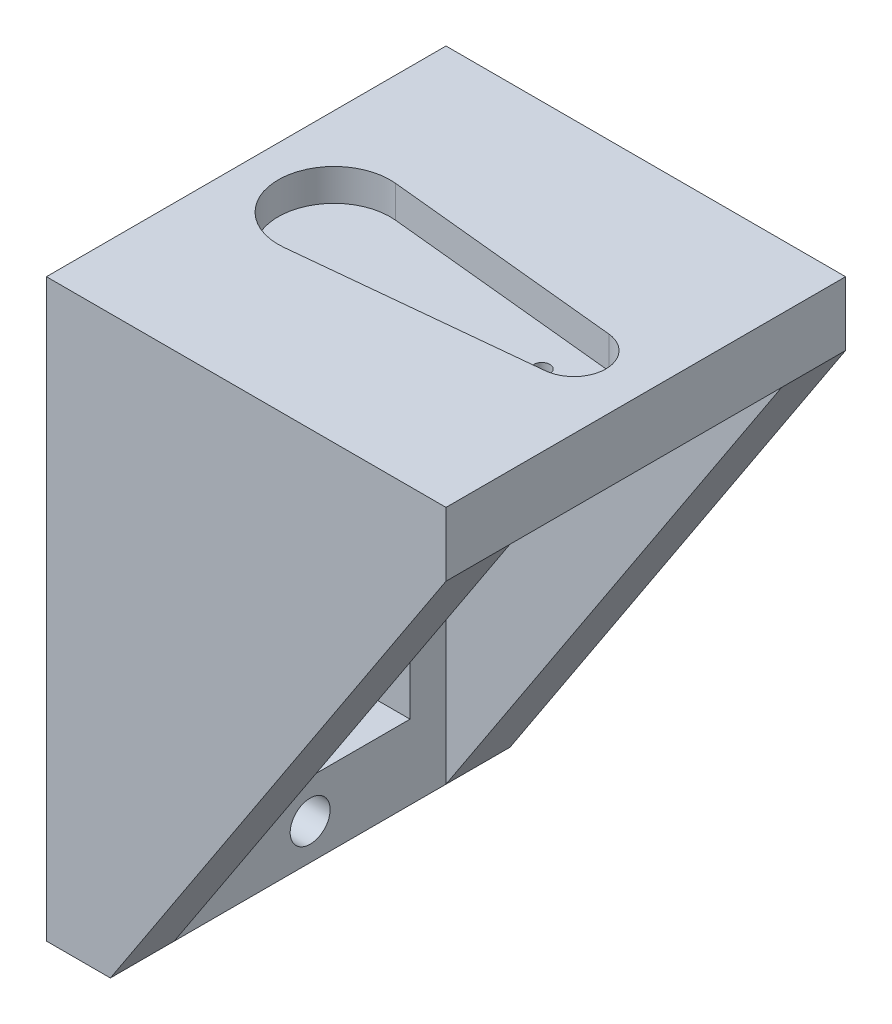
ISO-10303-21;
HEADER;
FILE_DESCRIPTION(('STEP AP214'),'2;1');
FILE_NAME('part.step','',(''),(''),'','','');
FILE_SCHEMA(('AUTOMOTIVE_DESIGN { 1 0 10303 214 1 1 1 1 }'));
ENDSEC;
DATA;
#1=APPLICATION_CONTEXT('core data for automotive mechanical design processes');
#2=APPLICATION_PROTOCOL_DEFINITION('international standard','automotive_design',2000,#1);
#3=PRODUCT_CONTEXT('',#1,'mechanical');
#4=PRODUCT('Part','Part','',(#3));
#5=PRODUCT_RELATED_PRODUCT_CATEGORY('part','',(#4));
#6=PRODUCT_DEFINITION_FORMATION('','',#4);
#7=PRODUCT_DEFINITION_CONTEXT('part definition',#1,'design');
#8=PRODUCT_DEFINITION('design','',#6,#7);
#9=PRODUCT_DEFINITION_SHAPE('','',#8);
#10=(LENGTH_UNIT() NAMED_UNIT(*) SI_UNIT(.MILLI.,.METRE.));
#11=(NAMED_UNIT(*) PLANE_ANGLE_UNIT() SI_UNIT($,.RADIAN.));
#12=(NAMED_UNIT(*) SI_UNIT($,.STERADIAN.) SOLID_ANGLE_UNIT());
#13=UNCERTAINTY_MEASURE_WITH_UNIT(LENGTH_MEASURE(1.E-05),#10,'distance_accuracy_value','');
#14=(GEOMETRIC_REPRESENTATION_CONTEXT(3) GLOBAL_UNCERTAINTY_ASSIGNED_CONTEXT((#13)) GLOBAL_UNIT_ASSIGNED_CONTEXT((#10,
#11,#12)) REPRESENTATION_CONTEXT('',''));
#15=CARTESIAN_POINT('',(0.,0.,0.));
#16=DIRECTION('',(0.,0.,1.));
#17=DIRECTION('',(1.,0.,0.));
#18=AXIS2_PLACEMENT_3D('',#15,#16,#17);
#19=CARTESIAN_POINT('',(12.5,4.,-12.5));
#20=DIRECTION('',(-1.,0.,0.));
#21=DIRECTION('',(0.,0.,1.));
#22=AXIS2_PLACEMENT_3D('',#19,#20,#21);
#23=PLANE('',#22);
#24=DIRECTION('',(0.,0.,-1.));
#25=VECTOR('',#24,1.);
#26=CARTESIAN_POINT('',(12.5,0.,23.5));
#27=LINE('',#26,#25);
#28=CARTESIAN_POINT('',(12.5,0.,-8.5));
#29=VERTEX_POINT('',#28);
#30=CARTESIAN_POINT('',(12.5,0.,-12.5));
#31=VERTEX_POINT('',#30);
#32=EDGE_CURVE('E225',#29,#31,#27,.T.);
#33=ORIENTED_EDGE('',*,*,#32,.T.);
#34=DIRECTION('',(0.,-1.,0.));
#35=VECTOR('',#34,1.);
#36=CARTESIAN_POINT('',(12.5,4.,-12.5));
#37=LINE('',#36,#35);
#38=CARTESIAN_POINT('',(12.5,4.,-12.5));
#39=VERTEX_POINT('',#38);
#40=EDGE_CURVE('E78',#39,#31,#37,.T.);
#41=ORIENTED_EDGE('',*,*,#40,.F.);
#42=DIRECTION('',(0.,0.,-1.));
#43=VECTOR('',#42,1.);
#44=CARTESIAN_POINT('',(12.5,4.,-12.5));
#45=LINE('',#44,#43);
#46=CARTESIAN_POINT('',(12.5,4.,12.5));
#47=VERTEX_POINT('',#46);
#48=EDGE_CURVE('E299',#47,#39,#45,.T.);
#49=ORIENTED_EDGE('',*,*,#48,.F.);
#50=DIRECTION('',(0.,-1.,0.));
#51=VECTOR('',#50,1.);
#52=CARTESIAN_POINT('',(12.5,4.,12.5));
#53=LINE('',#52,#51);
#54=CARTESIAN_POINT('',(12.5,0.,12.5));
#55=VERTEX_POINT('',#54);
#56=EDGE_CURVE('E308',#47,#55,#53,.T.);
#57=ORIENTED_EDGE('',*,*,#56,.T.);
#58=CARTESIAN_POINT('',(12.5,0.,8.5));
#59=VERTEX_POINT('',#58);
#60=EDGE_CURVE('E228',#55,#59,#27,.T.);
#61=ORIENTED_EDGE('',*,*,#60,.T.);
#62=DIRECTION('',(0.,0.,-1.));
#63=VECTOR('',#62,1.);
#64=CARTESIAN_POINT('',(12.5,0.,-12.5));
#65=LINE('',#64,#63);
#66=EDGE_CURVE('E298',#59,#29,#65,.T.);
#67=ORIENTED_EDGE('',*,*,#66,.T.);
#68=EDGE_LOOP('',(#33,#41,#49,#57,#61,#67));
#69=FACE_BOUND('',#68,.T.);
#70=ADVANCED_FACE('F71',(#69),#23,.F.);
#71=CARTESIAN_POINT('',(-12.5,4.,-12.5));
#72=DIRECTION('',(0.,0.,1.));
#73=DIRECTION('',(1.,0.,0.));
#74=AXIS2_PLACEMENT_3D('',#71,#72,#73);
#75=PLANE('',#74);
#76=DIRECTION('',(0.548649853768532,0.836052233990059,0.));
#77=VECTOR('',#76,1.);
#78=CARTESIAN_POINT('',(6.80938319268022,-8.67156504619843,-12.5));
#79=LINE('',#78,#77);
#80=CARTESIAN_POINT('',(-8.49963926512487,-32.,-12.5));
#81=VERTEX_POINT('',#80);
#82=EDGE_CURVE('E234',#81,#31,#79,.T.);
#83=ORIENTED_EDGE('',*,*,#82,.F.);
#84=DIRECTION('',(1.,0.,0.));
#85=VECTOR('',#84,1.);
#86=CARTESIAN_POINT('',(0.,-32.,-12.5));
#87=LINE('',#86,#85);
#88=CARTESIAN_POINT('',(-12.5,-32.,-12.5));
#89=VERTEX_POINT('',#88);
#90=EDGE_CURVE('E243',#89,#81,#87,.T.);
#91=ORIENTED_EDGE('',*,*,#90,.F.);
#92=DIRECTION('',(0.,-1.,0.));
#93=VECTOR('',#92,1.);
#94=CARTESIAN_POINT('',(-12.5,4.,-12.5));
#95=LINE('',#94,#93);
#96=CARTESIAN_POINT('',(-12.5,4.,-12.5));
#97=VERTEX_POINT('',#96);
#98=EDGE_CURVE('E316',#97,#89,#95,.T.);
#99=ORIENTED_EDGE('',*,*,#98,.F.);
#100=DIRECTION('',(-1.,0.,0.));
#101=VECTOR('',#100,1.);
#102=CARTESIAN_POINT('',(-12.5,4.,-12.5));
#103=LINE('',#102,#101);
#104=EDGE_CURVE('E302',#39,#97,#103,.T.);
#105=ORIENTED_EDGE('',*,*,#104,.F.);
#106=ORIENTED_EDGE('',*,*,#40,.T.);
#107=EDGE_LOOP('',(#83,#91,#99,#105,#106));
#108=FACE_BOUND('',#107,.T.);
#109=ADVANCED_FACE('F321',(#108),#75,.F.);
#110=CARTESIAN_POINT('',(-12.5,4.,12.5));
#111=DIRECTION('',(0.,0.,-1.));
#112=DIRECTION('',(-1.,0.,0.));
#113=AXIS2_PLACEMENT_3D('',#110,#111,#112);
#114=PLANE('',#113);
#115=DIRECTION('',(-0.548649853768532,-0.836052233990059,0.));
#116=VECTOR('',#115,1.);
#117=CARTESIAN_POINT('',(6.80938319268023,-8.67156504619843,12.5));
#118=LINE('',#117,#116);
#119=CARTESIAN_POINT('',(-8.49963926512487,-32.,12.5));
#120=VERTEX_POINT('',#119);
#121=EDGE_CURVE('E232',#55,#120,#118,.T.);
#122=ORIENTED_EDGE('',*,*,#121,.F.);
#123=ORIENTED_EDGE('',*,*,#56,.F.);
#124=DIRECTION('',(1.,0.,0.));
#125=VECTOR('',#124,1.);
#126=CARTESIAN_POINT('',(-12.5,4.,12.5));
#127=LINE('',#126,#125);
#128=CARTESIAN_POINT('',(-12.5,4.,12.5));
#129=VERTEX_POINT('',#128);
#130=EDGE_CURVE('E306',#129,#47,#127,.T.);
#131=ORIENTED_EDGE('',*,*,#130,.F.);
#132=DIRECTION('',(0.,-1.,0.));
#133=VECTOR('',#132,1.);
#134=CARTESIAN_POINT('',(-12.5,4.,12.5));
#135=LINE('',#134,#133);
#136=CARTESIAN_POINT('',(-12.5,-32.,12.5));
#137=VERTEX_POINT('',#136);
#138=EDGE_CURVE('E313',#129,#137,#135,.T.);
#139=ORIENTED_EDGE('',*,*,#138,.T.);
#140=DIRECTION('',(-1.,0.,0.));
#141=VECTOR('',#140,1.);
#142=CARTESIAN_POINT('',(0.,-32.,12.5));
#143=LINE('',#142,#141);
#144=EDGE_CURVE('E237',#120,#137,#143,.T.);
#145=ORIENTED_EDGE('',*,*,#144,.F.);
#146=EDGE_LOOP('',(#122,#123,#131,#139,#145));
#147=FACE_BOUND('',#146,.T.);
#148=ADVANCED_FACE('F357',(#147),#114,.F.);
#149=CARTESIAN_POINT('',(0.,-32.,8.49999999999999));
#150=DIRECTION('',(0.,0.,-1.));
#151=DIRECTION('',(-1.,0.,0.));
#152=AXIS2_PLACEMENT_3D('',#149,#150,#151);
#153=PLANE('',#152);
#154=DIRECTION('',(-1.,0.,0.));
#155=VECTOR('',#154,1.);
#156=CARTESIAN_POINT('',(0.,0.,8.49999999999999));
#157=LINE('',#156,#155);
#158=CARTESIAN_POINT('',(-8.49963926512487,0.,8.5));
#159=VERTEX_POINT('',#158);
#160=EDGE_CURVE('E250',#59,#159,#157,.T.);
#161=ORIENTED_EDGE('',*,*,#160,.F.);
#162=DIRECTION('',(-0.548649853768532,-0.836052233990059,0.));
#163=VECTOR('',#162,1.);
#164=CARTESIAN_POINT('',(-5.9411062249909,-28.1012160137314,8.49999999999999));
#165=LINE('',#164,#163);
#166=CARTESIAN_POINT('',(-8.49963926512487,-32.,8.5));
#167=VERTEX_POINT('',#166);
#168=EDGE_CURVE('E229',#59,#167,#165,.T.);
#169=ORIENTED_EDGE('',*,*,#168,.T.);
#170=DIRECTION('',(0.,1.,0.));
#171=VECTOR('',#170,1.);
#172=CARTESIAN_POINT('',(-8.49963926512487,-32.,8.5));
#173=LINE('',#172,#171);
#174=EDGE_CURVE('E249',#167,#159,#173,.T.);
#175=ORIENTED_EDGE('',*,*,#174,.T.);
#176=EDGE_LOOP('',(#161,#169,#175));
#177=FACE_BOUND('',#176,.T.);
#178=ADVANCED_FACE('F361',(#177),#153,.T.);
#179=CARTESIAN_POINT('',(0.,-32.,0.));
#180=DIRECTION('',(0.,-1.,0.));
#181=DIRECTION('',(0.,0.,-1.));
#182=AXIS2_PLACEMENT_3D('',#179,#180,#181);
#183=PLANE('',#182);
#184=ORIENTED_EDGE('',*,*,#90,.T.);
#185=DIRECTION('',(0.,0.,-1.));
#186=VECTOR('',#185,1.);
#187=CARTESIAN_POINT('',(-8.49963926512487,-32.,23.5));
#188=LINE('',#187,#186);
#189=CARTESIAN_POINT('',(-8.49963926512487,-32.,-8.50000000000001));
#190=VERTEX_POINT('',#189);
#191=EDGE_CURVE('E219',#190,#81,#188,.T.);
#192=ORIENTED_EDGE('',*,*,#191,.F.);
#193=DIRECTION('',(0.,0.,-1.));
#194=VECTOR('',#193,1.);
#195=CARTESIAN_POINT('',(-8.49963926512487,-32.,0.));
#196=LINE('',#195,#194);
#197=EDGE_CURVE('E246',#167,#190,#196,.T.);
#198=ORIENTED_EDGE('',*,*,#197,.F.);
#199=EDGE_CURVE('E224',#120,#167,#188,.T.);
#200=ORIENTED_EDGE('',*,*,#199,.F.);
#201=ORIENTED_EDGE('',*,*,#144,.T.);
#202=DIRECTION('',(0.,0.,-1.));
#203=VECTOR('',#202,1.);
#204=CARTESIAN_POINT('',(-12.5,-32.,0.));
#205=LINE('',#204,#203);
#206=EDGE_CURVE('E239',#137,#89,#205,.T.);
#207=ORIENTED_EDGE('',*,*,#206,.T.);
#208=EDGE_LOOP('',(#184,#192,#198,#200,#201,#207));
#209=FACE_BOUND('',#208,.T.);
#210=ADVANCED_FACE('F346',(#209),#183,.T.);
#211=CARTESIAN_POINT('',(12.5,-32.,-8.5));
#212=DIRECTION('',(0.,0.,-1.));
#213=DIRECTION('',(-1.,0.,0.));
#214=AXIS2_PLACEMENT_3D('',#211,#212,#213);
#215=PLANE('',#214);
#216=DIRECTION('',(-0.548649853768532,-0.836052233990059,0.));
#217=VECTOR('',#216,1.);
#218=CARTESIAN_POINT('',(-2.17839794948801,-22.3674668147126,-8.50000000000001));
#219=LINE('',#218,#217);
#220=EDGE_CURVE('E12',#29,#190,#219,.T.);
#221=ORIENTED_EDGE('',*,*,#220,.F.);
#222=DIRECTION('',(-1.,0.,0.));
#223=VECTOR('',#222,1.);
#224=CARTESIAN_POINT('',(12.5,0.,-8.5));
#225=LINE('',#224,#223);
#226=CARTESIAN_POINT('',(-8.49963926512487,0.,-8.5));
#227=VERTEX_POINT('',#226);
#228=EDGE_CURVE('E236',#29,#227,#225,.T.);
#229=ORIENTED_EDGE('',*,*,#228,.T.);
#230=DIRECTION('',(0.,1.,0.));
#231=VECTOR('',#230,1.);
#232=CARTESIAN_POINT('',(-8.49963926512487,-32.,-8.50000000000001));
#233=LINE('',#232,#231);
#234=EDGE_CURVE('E255',#190,#227,#233,.T.);
#235=ORIENTED_EDGE('',*,*,#234,.F.);
#236=EDGE_LOOP('',(#221,#229,#235));
#237=FACE_BOUND('',#236,.T.);
#238=ADVANCED_FACE('F335',(#237),#215,.F.);
#239=CARTESIAN_POINT('',(-12.5,4.,-12.5));
#240=DIRECTION('',(1.,0.,0.));
#241=DIRECTION('',(0.,0.,-1.));
#242=AXIS2_PLACEMENT_3D('',#239,#240,#241);
#243=PLANE('',#242);
#244=CARTESIAN_POINT('',(-12.5,-2.25000000000001,0.));
#245=DIRECTION('',(1.,0.,0.));
#246=DIRECTION('',(0.,0.,-1.));
#247=AXIS2_PLACEMENT_3D('',#244,#245,#246);
#248=CIRCLE('',#247,1.25);
#249=CARTESIAN_POINT('',(-12.5,-2.25000000000001,-1.25));
#250=VERTEX_POINT('',#249);
#251=EDGE_CURVE('E206',#250,#250,#248,.T.);
#252=ORIENTED_EDGE('',*,*,#251,.T.);
#253=EDGE_LOOP('',(#252));
#254=FACE_BOUND('',#253,.T.);
#255=CARTESIAN_POINT('',(-12.5,-29.75,0.));
#256=DIRECTION('',(1.,0.,0.));
#257=DIRECTION('',(0.,0.,-1.));
#258=AXIS2_PLACEMENT_3D('',#255,#256,#257);
#259=CIRCLE('',#258,1.25);
#260=CARTESIAN_POINT('',(-12.5,-29.75,-1.25));
#261=VERTEX_POINT('',#260);
#262=EDGE_CURVE('E572',#261,#261,#259,.T.);
#263=ORIENTED_EDGE('',*,*,#262,.T.);
#264=EDGE_LOOP('',(#263));
#265=FACE_BOUND('',#264,.T.);
#266=DIRECTION('',(0.,0.,1.));
#267=VECTOR('',#266,1.);
#268=CARTESIAN_POINT('',(-12.5,-4.65,-6.25));
#269=LINE('',#268,#267);
#270=CARTESIAN_POINT('',(-12.5,-4.65,-6.25));
#271=VERTEX_POINT('',#270);
#272=CARTESIAN_POINT('',(-12.5,-4.65000000000001,6.25));
#273=VERTEX_POINT('',#272);
#274=EDGE_CURVE('E190',#271,#273,#269,.T.);
#275=ORIENTED_EDGE('',*,*,#274,.T.);
#276=DIRECTION('',(0.,-1.,0.));
#277=VECTOR('',#276,1.);
#278=CARTESIAN_POINT('',(-12.5,-4.65000000000001,6.25));
#279=LINE('',#278,#277);
#280=CARTESIAN_POINT('',(-12.5,-27.35,6.25));
#281=VERTEX_POINT('',#280);
#282=EDGE_CURVE('E184',#273,#281,#279,.T.);
#283=ORIENTED_EDGE('',*,*,#282,.T.);
#284=DIRECTION('',(0.,0.,-1.));
#285=VECTOR('',#284,1.);
#286=CARTESIAN_POINT('',(-12.5,-27.35,-6.25));
#287=LINE('',#286,#285);
#288=CARTESIAN_POINT('',(-12.5,-27.35,-6.25));
#289=VERTEX_POINT('',#288);
#290=EDGE_CURVE('E193',#281,#289,#287,.T.);
#291=ORIENTED_EDGE('',*,*,#290,.T.);
#292=DIRECTION('',(0.,1.,0.));
#293=VECTOR('',#292,1.);
#294=CARTESIAN_POINT('',(-12.5,-4.65,-6.25));
#295=LINE('',#294,#293);
#296=EDGE_CURVE('E85',#289,#271,#295,.T.);
#297=ORIENTED_EDGE('',*,*,#296,.T.);
#298=EDGE_LOOP('',(#275,#283,#291,#297));
#299=FACE_BOUND('',#298,.T.);
#300=ORIENTED_EDGE('',*,*,#98,.T.);
#301=ORIENTED_EDGE('',*,*,#206,.F.);
#302=ORIENTED_EDGE('',*,*,#138,.F.);
#303=DIRECTION('',(0.,0.,1.));
#304=VECTOR('',#303,1.);
#305=CARTESIAN_POINT('',(-12.5,4.,-12.5));
#306=LINE('',#305,#304);
#307=EDGE_CURVE('E304',#97,#129,#306,.T.);
#308=ORIENTED_EDGE('',*,*,#307,.F.);
#309=EDGE_LOOP('',(#300,#301,#302,#308));
#310=FACE_BOUND('',#309,.T.);
#311=ADVANCED_FACE('F197',(#254,#265,#299,#310),#243,.F.);
#312=CARTESIAN_POINT('',(0.,4.,0.));
#313=DIRECTION('',(0.,1.,0.));
#314=DIRECTION('',(0.,0.,1.));
#315=AXIS2_PLACEMENT_3D('',#312,#313,#314);
#316=PLANE('',#315);
#317=CARTESIAN_POINT('',(-7.,4.,0.));
#318=DIRECTION('',(0.,1.,0.));
#319=DIRECTION('',(0.,0.,1.));
#320=AXIS2_PLACEMENT_3D('',#317,#318,#319);
#321=CIRCLE('',#320,3.5);
#322=CARTESIAN_POINT('',(-6.65,4.,-3.48245602987317));
#323=VERTEX_POINT('',#322);
#324=CARTESIAN_POINT('',(-6.65,4.,3.48245602987317));
#325=VERTEX_POINT('',#324);
#326=EDGE_CURVE('E282',#323,#325,#321,.T.);
#327=ORIENTED_EDGE('',*,*,#326,.F.);
#328=DIRECTION('',(0.99498743710662,0.,0.1));
#329=VECTOR('',#328,1.);
#330=CARTESIAN_POINT('',(0.28,4.,-2.78596482389854));
#331=LINE('',#330,#329);
#332=CARTESIAN_POINT('',(8.2,4.,-1.98997487421324));
#333=VERTEX_POINT('',#332);
#334=EDGE_CURVE('E295',#323,#333,#331,.T.);
#335=ORIENTED_EDGE('',*,*,#334,.T.);
#336=CARTESIAN_POINT('',(8.,4.,0.));
#337=DIRECTION('',(0.,1.,0.));
#338=DIRECTION('',(0.,0.,1.));
#339=AXIS2_PLACEMENT_3D('',#336,#337,#338);
#340=CIRCLE('',#339,2.);
#341=CARTESIAN_POINT('',(8.2,4.,1.98997487421324));
#342=VERTEX_POINT('',#341);
#343=EDGE_CURVE('E293',#342,#333,#340,.T.);
#344=ORIENTED_EDGE('',*,*,#343,.F.);
#345=DIRECTION('',(0.99498743710662,0.,-0.1));
#346=VECTOR('',#345,1.);
#347=CARTESIAN_POINT('',(0.28,4.,2.78596482389854));
#348=LINE('',#347,#346);
#349=EDGE_CURVE('E291',#325,#342,#348,.T.);
#350=ORIENTED_EDGE('',*,*,#349,.F.);
#351=EDGE_LOOP('',(#327,#335,#344,#350));
#352=FACE_BOUND('',#351,.T.);
#353=ORIENTED_EDGE('',*,*,#48,.T.);
#354=ORIENTED_EDGE('',*,*,#104,.T.);
#355=ORIENTED_EDGE('',*,*,#307,.T.);
#356=ORIENTED_EDGE('',*,*,#130,.T.);
#357=EDGE_LOOP('',(#353,#354,#355,#356));
#358=FACE_BOUND('',#357,.T.);
#359=ADVANCED_FACE('F353',(#352,#358),#316,.T.);
#360=CARTESIAN_POINT('',(0.,0.,0.));
#361=DIRECTION('',(0.,1.,0.));
#362=DIRECTION('',(0.,0.,1.));
#363=AXIS2_PLACEMENT_3D('',#360,#361,#362);
#364=PLANE('',#363);
#365=CARTESIAN_POINT('',(6.,0.,0.));
#366=DIRECTION('',(0.,1.,0.));
#367=DIRECTION('',(0.,0.,1.));
#368=AXIS2_PLACEMENT_3D('',#365,#366,#367);
#369=CIRCLE('',#368,0.5);
#370=CARTESIAN_POINT('',(6.,0.,0.5));
#371=VERTEX_POINT('',#370);
#372=EDGE_CURVE('E263',#371,#371,#369,.T.);
#373=ORIENTED_EDGE('',*,*,#372,.T.);
#374=EDGE_LOOP('',(#373));
#375=FACE_BOUND('',#374,.T.);
#376=ORIENTED_EDGE('',*,*,#66,.F.);
#377=ORIENTED_EDGE('',*,*,#160,.T.);
#378=DIRECTION('',(0.,0.,-1.));
#379=VECTOR('',#378,1.);
#380=CARTESIAN_POINT('',(-8.49963926512487,0.,0.));
#381=LINE('',#380,#379);
#382=EDGE_CURVE('E240',#159,#227,#381,.T.);
#383=ORIENTED_EDGE('',*,*,#382,.T.);
#384=ORIENTED_EDGE('',*,*,#228,.F.);
#385=EDGE_LOOP('',(#376,#377,#383,#384));
#386=FACE_BOUND('',#385,.T.);
#387=ADVANCED_FACE('F337',(#375,#386),#364,.F.);
#388=CARTESIAN_POINT('',(8.2,2.,-1.98997487421324));
#389=DIRECTION('',(0.1,0.,-0.99498743710662));
#390=DIRECTION('',(-0.99498743710662,0.,-0.1));
#391=AXIS2_PLACEMENT_3D('',#388,#389,#390);
#392=PLANE('',#391);
#393=ORIENTED_EDGE('',*,*,#334,.F.);
#394=DIRECTION('',(0.,1.,0.));
#395=VECTOR('',#394,1.);
#396=CARTESIAN_POINT('',(-6.65,2.,-3.48245602987317));
#397=LINE('',#396,#395);
#398=CARTESIAN_POINT('',(-6.65,2.,-3.48245602987317));
#399=VERTEX_POINT('',#398);
#400=EDGE_CURVE('E278',#399,#323,#397,.T.);
#401=ORIENTED_EDGE('',*,*,#400,.F.);
#402=DIRECTION('',(-0.99498743710662,0.,-0.1));
#403=VECTOR('',#402,1.);
#404=CARTESIAN_POINT('',(8.2,2.,-1.98997487421324));
#405=LINE('',#404,#403);
#406=CARTESIAN_POINT('',(8.2,2.,-1.98997487421324));
#407=VERTEX_POINT('',#406);
#408=EDGE_CURVE('E266',#407,#399,#405,.T.);
#409=ORIENTED_EDGE('',*,*,#408,.F.);
#410=DIRECTION('',(0.,1.,0.));
#411=VECTOR('',#410,1.);
#412=CARTESIAN_POINT('',(8.2,2.,-1.98997487421324));
#413=LINE('',#412,#411);
#414=EDGE_CURVE('E279',#407,#333,#413,.T.);
#415=ORIENTED_EDGE('',*,*,#414,.T.);
#416=EDGE_LOOP('',(#393,#401,#409,#415));
#417=FACE_BOUND('',#416,.T.);
#418=ADVANCED_FACE('F385',(#417),#392,.F.);
#419=CARTESIAN_POINT('',(8.,2.,0.));
#420=DIRECTION('',(0.,1.,0.));
#421=DIRECTION('',(0.,0.,1.));
#422=AXIS2_PLACEMENT_3D('',#419,#420,#421);
#423=CYLINDRICAL_SURFACE('',#422,2.);
#424=ORIENTED_EDGE('',*,*,#343,.T.);
#425=ORIENTED_EDGE('',*,*,#414,.F.);
#426=CARTESIAN_POINT('',(8.,2.,0.));
#427=DIRECTION('',(0.,1.,0.));
#428=DIRECTION('',(0.,0.,1.));
#429=AXIS2_PLACEMENT_3D('',#426,#427,#428);
#430=CIRCLE('',#429,2.);
#431=CARTESIAN_POINT('',(8.2,2.,1.98997487421324));
#432=VERTEX_POINT('',#431);
#433=EDGE_CURVE('E275',#432,#407,#430,.T.);
#434=ORIENTED_EDGE('',*,*,#433,.F.);
#435=DIRECTION('',(0.,1.,0.));
#436=VECTOR('',#435,1.);
#437=CARTESIAN_POINT('',(8.2,2.,1.98997487421324));
#438=LINE('',#437,#436);
#439=EDGE_CURVE('E283',#432,#342,#438,.T.);
#440=ORIENTED_EDGE('',*,*,#439,.T.);
#441=EDGE_LOOP('',(#424,#425,#434,#440));
#442=FACE_BOUND('',#441,.T.);
#443=ADVANCED_FACE('F392',(#442),#423,.F.);
#444=CARTESIAN_POINT('',(-6.65,2.,3.48245602987317));
#445=DIRECTION('',(0.1,0.,0.99498743710662));
#446=DIRECTION('',(0.99498743710662,0.,-0.1));
#447=AXIS2_PLACEMENT_3D('',#444,#445,#446);
#448=PLANE('',#447);
#449=ORIENTED_EDGE('',*,*,#349,.T.);
#450=ORIENTED_EDGE('',*,*,#439,.F.);
#451=DIRECTION('',(0.99498743710662,0.,-0.1));
#452=VECTOR('',#451,1.);
#453=CARTESIAN_POINT('',(-6.65,2.,3.48245602987317));
#454=LINE('',#453,#452);
#455=CARTESIAN_POINT('',(-6.65,2.,3.48245602987317));
#456=VERTEX_POINT('',#455);
#457=EDGE_CURVE('E272',#456,#432,#454,.T.);
#458=ORIENTED_EDGE('',*,*,#457,.F.);
#459=DIRECTION('',(0.,1.,0.));
#460=VECTOR('',#459,1.);
#461=CARTESIAN_POINT('',(-6.65,2.,3.48245602987317));
#462=LINE('',#461,#460);
#463=EDGE_CURVE('E286',#456,#325,#462,.T.);
#464=ORIENTED_EDGE('',*,*,#463,.T.);
#465=EDGE_LOOP('',(#449,#450,#458,#464));
#466=FACE_BOUND('',#465,.T.);
#467=ADVANCED_FACE('F398',(#466),#448,.F.);
#468=CARTESIAN_POINT('',(-7.,2.,0.));
#469=DIRECTION('',(0.,1.,0.));
#470=DIRECTION('',(0.,0.,1.));
#471=AXIS2_PLACEMENT_3D('',#468,#469,#470);
#472=CYLINDRICAL_SURFACE('',#471,3.5);
#473=ORIENTED_EDGE('',*,*,#326,.T.);
#474=ORIENTED_EDGE('',*,*,#463,.F.);
#475=CARTESIAN_POINT('',(-7.,2.,0.));
#476=DIRECTION('',(0.,1.,0.));
#477=DIRECTION('',(0.,0.,1.));
#478=AXIS2_PLACEMENT_3D('',#475,#476,#477);
#479=CIRCLE('',#478,3.5);
#480=EDGE_CURVE('E269',#399,#456,#479,.T.);
#481=ORIENTED_EDGE('',*,*,#480,.F.);
#482=ORIENTED_EDGE('',*,*,#400,.T.);
#483=EDGE_LOOP('',(#473,#474,#481,#482));
#484=FACE_BOUND('',#483,.T.);
#485=ADVANCED_FACE('F394',(#484),#472,.F.);
#486=CARTESIAN_POINT('',(-7.,2.,0.));
#487=DIRECTION('',(0.,1.,0.));
#488=DIRECTION('',(0.,0.,1.));
#489=AXIS2_PLACEMENT_3D('',#486,#487,#488);
#490=PLANE('',#489);
#491=CARTESIAN_POINT('',(6.,2.,0.));
#492=DIRECTION('',(0.,1.,0.));
#493=DIRECTION('',(0.,0.,1.));
#494=AXIS2_PLACEMENT_3D('',#491,#492,#493);
#495=CIRCLE('',#494,0.5);
#496=CARTESIAN_POINT('',(6.,2.,0.5));
#497=VERTEX_POINT('',#496);
#498=EDGE_CURVE('E258',#497,#497,#495,.T.);
#499=ORIENTED_EDGE('',*,*,#498,.F.);
#500=EDGE_LOOP('',(#499));
#501=FACE_BOUND('',#500,.T.);
#502=ORIENTED_EDGE('',*,*,#408,.T.);
#503=ORIENTED_EDGE('',*,*,#480,.T.);
#504=ORIENTED_EDGE('',*,*,#457,.T.);
#505=ORIENTED_EDGE('',*,*,#433,.T.);
#506=EDGE_LOOP('',(#502,#503,#504,#505));
#507=FACE_BOUND('',#506,.T.);
#508=ADVANCED_FACE('F397',(#501,#507),#490,.T.);
#509=CARTESIAN_POINT('',(6.,-4.,0.));
#510=DIRECTION('',(0.,1.,0.));
#511=DIRECTION('',(0.,0.,1.));
#512=AXIS2_PLACEMENT_3D('',#509,#510,#511);
#513=CYLINDRICAL_SURFACE('',#512,0.5);
#514=ORIENTED_EDGE('',*,*,#498,.T.);
#515=EDGE_LOOP('',(#514));
#516=FACE_BOUND('',#515,.T.);
#517=ORIENTED_EDGE('',*,*,#372,.F.);
#518=EDGE_LOOP('',(#517));
#519=FACE_BOUND('',#518,.T.);
#520=ADVANCED_FACE('F408',(#516,#519),#513,.F.);
#521=CARTESIAN_POINT('',(-8.49963926512487,-32.,0.));
#522=DIRECTION('',(1.,0.,0.));
#523=DIRECTION('',(0.,0.,-1.));
#524=AXIS2_PLACEMENT_3D('',#521,#522,#523);
#525=PLANE('',#524);
#526=CARTESIAN_POINT('',(-8.49963926512487,-2.25000000000001,0.));
#527=DIRECTION('',(1.,0.,0.));
#528=DIRECTION('',(0.,0.,-1.));
#529=AXIS2_PLACEMENT_3D('',#526,#527,#528);
#530=CIRCLE('',#529,1.25);
#531=CARTESIAN_POINT('',(-8.49963926512487,-2.25000000000001,-1.25));
#532=VERTEX_POINT('',#531);
#533=EDGE_CURVE('E571',#532,#532,#530,.T.);
#534=ORIENTED_EDGE('',*,*,#533,.F.);
#535=EDGE_LOOP('',(#534));
#536=FACE_BOUND('',#535,.T.);
#537=CARTESIAN_POINT('',(-8.49963926512487,-29.75,0.));
#538=DIRECTION('',(1.,0.,0.));
#539=DIRECTION('',(0.,0.,-1.));
#540=AXIS2_PLACEMENT_3D('',#537,#538,#539);
#541=CIRCLE('',#540,1.25);
#542=CARTESIAN_POINT('',(-8.49963926512487,-29.75,-1.25));
#543=VERTEX_POINT('',#542);
#544=EDGE_CURVE('E213',#543,#543,#541,.T.);
#545=ORIENTED_EDGE('',*,*,#544,.F.);
#546=EDGE_LOOP('',(#545));
#547=FACE_BOUND('',#546,.T.);
#548=DIRECTION('',(0.,-1.,0.));
#549=VECTOR('',#548,1.);
#550=CARTESIAN_POINT('',(-8.49963926512487,-4.65000000000001,6.25));
#551=LINE('',#550,#549);
#552=CARTESIAN_POINT('',(-8.49963926512487,-4.65000000000001,6.25));
#553=VERTEX_POINT('',#552);
#554=CARTESIAN_POINT('',(-8.49963926512487,-27.35,6.25));
#555=VERTEX_POINT('',#554);
#556=EDGE_CURVE('E93',#553,#555,#551,.T.);
#557=ORIENTED_EDGE('',*,*,#556,.F.);
#558=DIRECTION('',(0.,0.,1.));
#559=VECTOR('',#558,1.);
#560=CARTESIAN_POINT('',(-8.49963926512487,-4.65,-6.25));
#561=LINE('',#560,#559);
#562=CARTESIAN_POINT('',(-8.49963926512487,-4.65,-6.25));
#563=VERTEX_POINT('',#562);
#564=EDGE_CURVE('E200',#563,#553,#561,.T.);
#565=ORIENTED_EDGE('',*,*,#564,.F.);
#566=DIRECTION('',(0.,1.,0.));
#567=VECTOR('',#566,1.);
#568=CARTESIAN_POINT('',(-8.49963926512487,-4.65,-6.25));
#569=LINE('',#568,#567);
#570=CARTESIAN_POINT('',(-8.49963926512487,-27.35,-6.25));
#571=VERTEX_POINT('',#570);
#572=EDGE_CURVE('E203',#571,#563,#569,.T.);
#573=ORIENTED_EDGE('',*,*,#572,.F.);
#574=DIRECTION('',(0.,0.,-1.));
#575=VECTOR('',#574,1.);
#576=CARTESIAN_POINT('',(-8.49963926512487,-27.35,-6.25));
#577=LINE('',#576,#575);
#578=EDGE_CURVE('E212',#555,#571,#577,.T.);
#579=ORIENTED_EDGE('',*,*,#578,.F.);
#580=EDGE_LOOP('',(#557,#565,#573,#579));
#581=FACE_BOUND('',#580,.T.);
#582=ORIENTED_EDGE('',*,*,#197,.T.);
#583=ORIENTED_EDGE('',*,*,#234,.T.);
#584=ORIENTED_EDGE('',*,*,#382,.F.);
#585=ORIENTED_EDGE('',*,*,#174,.F.);
#586=EDGE_LOOP('',(#582,#583,#584,#585));
#587=FACE_BOUND('',#586,.T.);
#588=ADVANCED_FACE('F342',(#536,#547,#581,#587),#525,.T.);
#589=CARTESIAN_POINT('',(12.5,0.,23.5));
#590=DIRECTION('',(0.836052233990059,-0.548649853768532,0.));
#591=DIRECTION('',(0.548649853768532,0.836052233990059,0.));
#592=AXIS2_PLACEMENT_3D('',#589,#590,#591);
#593=PLANE('',#592);
#594=ORIENTED_EDGE('',*,*,#82,.T.);
#595=ORIENTED_EDGE('',*,*,#32,.F.);
#596=ORIENTED_EDGE('',*,*,#220,.T.);
#597=ORIENTED_EDGE('',*,*,#191,.T.);
#598=EDGE_LOOP('',(#594,#595,#596,#597));
#599=FACE_BOUND('',#598,.T.);
#600=ADVANCED_FACE('F330',(#599),#593,.T.);
#601=ORIENTED_EDGE('',*,*,#121,.T.);
#602=ORIENTED_EDGE('',*,*,#199,.T.);
#603=ORIENTED_EDGE('',*,*,#168,.F.);
#604=ORIENTED_EDGE('',*,*,#60,.F.);
#605=EDGE_LOOP('',(#601,#602,#603,#604));
#606=FACE_BOUND('',#605,.T.);
#607=ADVANCED_FACE('F359',(#606),#593,.T.);
#608=CARTESIAN_POINT('',(-12.5,-4.65000000000001,6.25));
#609=DIRECTION('',(0.,0.,1.));
#610=DIRECTION('',(1.,0.,0.));
#611=AXIS2_PLACEMENT_3D('',#608,#609,#610);
#612=PLANE('',#611);
#613=ORIENTED_EDGE('',*,*,#556,.T.);
#614=DIRECTION('',(1.,0.,0.));
#615=VECTOR('',#614,1.);
#616=CARTESIAN_POINT('',(-12.5,-27.35,6.25));
#617=LINE('',#616,#615);
#618=EDGE_CURVE('E180',#281,#555,#617,.T.);
#619=ORIENTED_EDGE('',*,*,#618,.F.);
#620=ORIENTED_EDGE('',*,*,#282,.F.);
#621=DIRECTION('',(1.,0.,0.));
#622=VECTOR('',#621,1.);
#623=CARTESIAN_POINT('',(-12.5,-4.65000000000001,6.25));
#624=LINE('',#623,#622);
#625=EDGE_CURVE('E217',#273,#553,#624,.T.);
#626=ORIENTED_EDGE('',*,*,#625,.T.);
#627=EDGE_LOOP('',(#613,#619,#620,#626));
#628=FACE_BOUND('',#627,.T.);
#629=ADVANCED_FACE('F182',(#628),#612,.F.);
#630=CARTESIAN_POINT('',(-12.5,-4.65,-6.25));
#631=DIRECTION('',(0.,1.,0.));
#632=DIRECTION('',(0.,0.,1.));
#633=AXIS2_PLACEMENT_3D('',#630,#631,#632);
#634=PLANE('',#633);
#635=ORIENTED_EDGE('',*,*,#564,.T.);
#636=ORIENTED_EDGE('',*,*,#625,.F.);
#637=ORIENTED_EDGE('',*,*,#274,.F.);
#638=DIRECTION('',(1.,0.,0.));
#639=VECTOR('',#638,1.);
#640=CARTESIAN_POINT('',(-12.5,-4.65,-6.25));
#641=LINE('',#640,#639);
#642=EDGE_CURVE('E220',#271,#563,#641,.T.);
#643=ORIENTED_EDGE('',*,*,#642,.T.);
#644=EDGE_LOOP('',(#635,#636,#637,#643));
#645=FACE_BOUND('',#644,.T.);
#646=ADVANCED_FACE('F457',(#645),#634,.F.);
#647=CARTESIAN_POINT('',(-12.5,-4.65,-6.25));
#648=DIRECTION('',(0.,0.,-1.));
#649=DIRECTION('',(0.,1.,0.));
#650=AXIS2_PLACEMENT_3D('',#647,#648,#649);
#651=PLANE('',#650);
#652=ORIENTED_EDGE('',*,*,#572,.T.);
#653=ORIENTED_EDGE('',*,*,#642,.F.);
#654=ORIENTED_EDGE('',*,*,#296,.F.);
#655=DIRECTION('',(1.,0.,0.));
#656=VECTOR('',#655,1.);
#657=CARTESIAN_POINT('',(-12.5,-27.35,-6.25));
#658=LINE('',#657,#656);
#659=EDGE_CURVE('E189',#289,#571,#658,.T.);
#660=ORIENTED_EDGE('',*,*,#659,.T.);
#661=EDGE_LOOP('',(#652,#653,#654,#660));
#662=FACE_BOUND('',#661,.T.);
#663=ADVANCED_FACE('F465',(#662),#651,.F.);
#664=CARTESIAN_POINT('',(-12.5,-27.35,-6.25));
#665=DIRECTION('',(0.,-1.,0.));
#666=DIRECTION('',(0.,0.,-1.));
#667=AXIS2_PLACEMENT_3D('',#664,#665,#666);
#668=PLANE('',#667);
#669=ORIENTED_EDGE('',*,*,#578,.T.);
#670=ORIENTED_EDGE('',*,*,#659,.F.);
#671=ORIENTED_EDGE('',*,*,#290,.F.);
#672=ORIENTED_EDGE('',*,*,#618,.T.);
#673=EDGE_LOOP('',(#669,#670,#671,#672));
#674=FACE_BOUND('',#673,.T.);
#675=ADVANCED_FACE('F194',(#674),#668,.F.);
#676=CARTESIAN_POINT('',(-12.5,-29.75,0.));
#677=DIRECTION('',(1.,0.,0.));
#678=DIRECTION('',(0.,0.,-1.));
#679=AXIS2_PLACEMENT_3D('',#676,#677,#678);
#680=CYLINDRICAL_SURFACE('',#679,1.25);
#681=ORIENTED_EDGE('',*,*,#262,.F.);
#682=EDGE_LOOP('',(#681));
#683=FACE_BOUND('',#682,.T.);
#684=ORIENTED_EDGE('',*,*,#544,.T.);
#685=EDGE_LOOP('',(#684));
#686=FACE_BOUND('',#685,.T.);
#687=ADVANCED_FACE('F481',(#683,#686),#680,.F.);
#688=CARTESIAN_POINT('',(-12.5,-2.25000000000001,0.));
#689=DIRECTION('',(1.,0.,0.));
#690=DIRECTION('',(0.,0.,-1.));
#691=AXIS2_PLACEMENT_3D('',#688,#689,#690);
#692=CYLINDRICAL_SURFACE('',#691,1.25);
#693=ORIENTED_EDGE('',*,*,#251,.F.);
#694=EDGE_LOOP('',(#693));
#695=FACE_BOUND('',#694,.T.);
#696=ORIENTED_EDGE('',*,*,#533,.T.);
#697=EDGE_LOOP('',(#696));
#698=FACE_BOUND('',#697,.T.);
#699=ADVANCED_FACE('F489',(#695,#698),#692,.F.);
#700=CLOSED_SHELL('',(#70,#109,#148,#178,#210,#238,#311,#359,#387,#418,#443,#467,#485,#508,#520,
#588,#600,#607,#629,#646,#663,#675,#687,#699));
#701=MANIFOLD_SOLID_BREP('B2',#700);
#702=ADVANCED_BREP_SHAPE_REPRESENTATION('',(#18,#701),#14);
#703=SHAPE_DEFINITION_REPRESENTATION(#9,#702);
ENDSEC;
END-ISO-10303-21;
